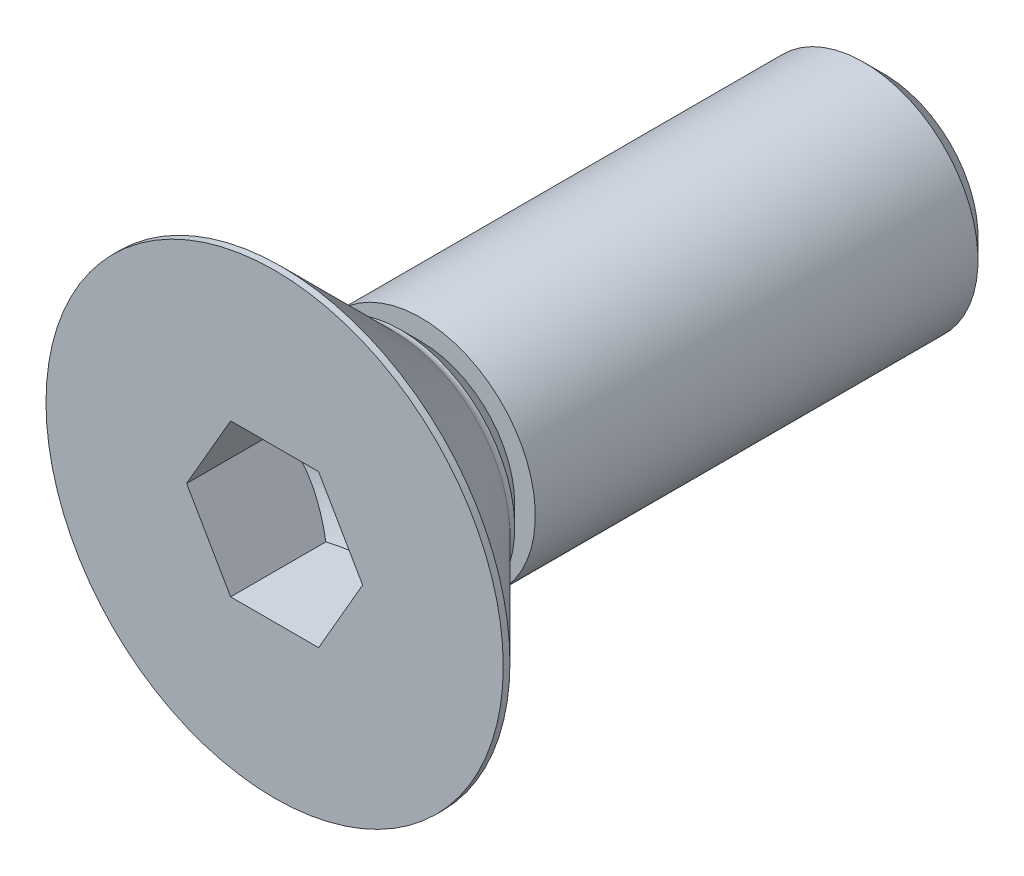
ISO-10303-21;
HEADER;
FILE_DESCRIPTION(('STEP AP214'),'2;1');
FILE_NAME('part.step','',(''),(''),'','','');
FILE_SCHEMA(('AUTOMOTIVE_DESIGN { 1 0 10303 214 1 1 1 1 }'));
ENDSEC;
DATA;
#1=APPLICATION_CONTEXT('core data for automotive mechanical design processes');
#2=APPLICATION_PROTOCOL_DEFINITION('international standard','automotive_design',2000,#1);
#3=PRODUCT_CONTEXT('',#1,'mechanical');
#4=PRODUCT('Part','Part','',(#3));
#5=PRODUCT_RELATED_PRODUCT_CATEGORY('part','',(#4));
#6=PRODUCT_DEFINITION_FORMATION('','',#4);
#7=PRODUCT_DEFINITION_CONTEXT('part definition',#1,'design');
#8=PRODUCT_DEFINITION('design','',#6,#7);
#9=PRODUCT_DEFINITION_SHAPE('','',#8);
#10=(LENGTH_UNIT() NAMED_UNIT(*) SI_UNIT(.MILLI.,.METRE.));
#11=(NAMED_UNIT(*) PLANE_ANGLE_UNIT() SI_UNIT($,.RADIAN.));
#12=(NAMED_UNIT(*) SI_UNIT($,.STERADIAN.) SOLID_ANGLE_UNIT());
#13=UNCERTAINTY_MEASURE_WITH_UNIT(LENGTH_MEASURE(1.E-05),#10,'distance_accuracy_value','');
#14=(GEOMETRIC_REPRESENTATION_CONTEXT(3) GLOBAL_UNCERTAINTY_ASSIGNED_CONTEXT((#13)) GLOBAL_UNIT_ASSIGNED_CONTEXT((#10,
#11,#12)) REPRESENTATION_CONTEXT('',''));
#15=CARTESIAN_POINT('',(0.,0.,0.));
#16=DIRECTION('',(0.,0.,1.));
#17=DIRECTION('',(1.,0.,0.));
#18=AXIS2_PLACEMENT_3D('',#15,#16,#17);
#19=CARTESIAN_POINT('',(0.,0.,-3.3));
#20=DIRECTION('',(0.,0.,-1.));
#21=DIRECTION('',(-1.,0.,0.));
#22=AXIS2_PLACEMENT_3D('',#19,#20,#21);
#23=TOROIDAL_SURFACE('',#22,3.3,0.3);
#24=CARTESIAN_POINT('',(0.,0.,-3.08786796564404));
#25=DIRECTION('',(0.,0.,-1.));
#26=DIRECTION('',(0.,1.,0.));
#27=AXIS2_PLACEMENT_3D('',#24,#25,#26);
#28=CIRCLE('',#27,3.08786796564404);
#29=CARTESIAN_POINT('',(0.,3.08786796564404,-3.08786796564404));
#30=VERTEX_POINT('',#29);
#31=EDGE_CURVE('E202',#30,#30,#28,.T.);
#32=ORIENTED_EDGE('',*,*,#31,.T.);
#33=EDGE_LOOP('',(#32));
#34=FACE_BOUND('',#33,.T.);
#35=CARTESIAN_POINT('',(0.,0.,-3.3));
#36=DIRECTION('',(0.,0.,-1.));
#37=DIRECTION('',(0.,1.,0.));
#38=AXIS2_PLACEMENT_3D('',#35,#36,#37);
#39=CIRCLE('',#38,3.);
#40=CARTESIAN_POINT('',(0.,3.,-3.3));
#41=VERTEX_POINT('',#40);
#42=EDGE_CURVE('E254',#41,#41,#39,.T.);
#43=ORIENTED_EDGE('',*,*,#42,.F.);
#44=EDGE_LOOP('',(#43));
#45=FACE_BOUND('',#44,.T.);
#46=ADVANCED_FACE('F46',(#34,#45),#23,.F.);
#47=CARTESIAN_POINT('',(0.,0.,-1.63180194846605));
#48=DIRECTION('',(0.,0.,1.));
#49=DIRECTION('',(0.,1.,0.));
#50=AXIS2_PLACEMENT_3D('',#47,#48,#49);
#51=CONICAL_SURFACE('',#50,4.54393398282202,0.785398163397448);
#52=CARTESIAN_POINT('',(0.,0.,-0.17573593128807));
#53=DIRECTION('',(0.,0.,-1.));
#54=DIRECTION('',(0.,1.,0.));
#55=AXIS2_PLACEMENT_3D('',#52,#53,#54);
#56=CIRCLE('',#55,6.);
#57=CARTESIAN_POINT('',(0.,6.,-0.17573593128807));
#58=VERTEX_POINT('',#57);
#59=EDGE_CURVE('E181',#58,#58,#56,.T.);
#60=ORIENTED_EDGE('',*,*,#59,.T.);
#61=EDGE_LOOP('',(#60));
#62=FACE_BOUND('',#61,.T.);
#63=ORIENTED_EDGE('',*,*,#31,.F.);
#64=EDGE_LOOP('',(#63));
#65=FACE_BOUND('',#64,.T.);
#66=ADVANCED_FACE('F295',(#62,#65),#51,.T.);
#67=CARTESIAN_POINT('',(0.,0.,-0.0878679656440351));
#68=DIRECTION('',(0.,0.,1.));
#69=DIRECTION('',(0.,1.,0.));
#70=AXIS2_PLACEMENT_3D('',#67,#68,#69);
#71=CYLINDRICAL_SURFACE('',#70,6.);
#72=CARTESIAN_POINT('',(0.,0.,0.));
#73=DIRECTION('',(0.,0.,-1.));
#74=DIRECTION('',(0.,1.,0.));
#75=AXIS2_PLACEMENT_3D('',#72,#73,#74);
#76=CIRCLE('',#75,6.);
#77=CARTESIAN_POINT('',(0.,6.,0.));
#78=VERTEX_POINT('',#77);
#79=EDGE_CURVE('E245',#78,#78,#76,.T.);
#80=ORIENTED_EDGE('',*,*,#79,.T.);
#81=EDGE_LOOP('',(#80));
#82=FACE_BOUND('',#81,.T.);
#83=ORIENTED_EDGE('',*,*,#59,.F.);
#84=EDGE_LOOP('',(#83));
#85=FACE_BOUND('',#84,.T.);
#86=ADVANCED_FACE('F298',(#82,#85),#71,.T.);
#87=CARTESIAN_POINT('',(0.,3.,0.));
#88=DIRECTION('',(0.,0.,1.));
#89=DIRECTION('',(0.,-1.,0.));
#90=AXIS2_PLACEMENT_3D('',#87,#88,#89);
#91=PLANE('',#90);
#92=ORIENTED_EDGE('',*,*,#79,.F.);
#93=EDGE_LOOP('',(#92));
#94=FACE_BOUND('',#93,.T.);
#95=DIRECTION('',(-0.5,0.866025403784439,0.));
#96=VECTOR('',#95,1.);
#97=CARTESIAN_POINT('',(-2.38156905283833,0.125000466250108,0.));
#98=LINE('',#97,#96);
#99=CARTESIAN_POINT('',(-1.1547,-1.99999906749978,0.));
#100=VERTEX_POINT('',#99);
#101=CARTESIAN_POINT('',(-2.3094,0.,0.));
#102=VERTEX_POINT('',#101);
#103=EDGE_CURVE('E215',#100,#102,#98,.T.);
#104=ORIENTED_EDGE('',*,*,#103,.T.);
#105=DIRECTION('',(0.5,0.866025403784439,0.));
#106=VECTOR('',#105,1.);
#107=CARTESIAN_POINT('',(-1.08253094716167,2.12499953374989,0.));
#108=LINE('',#107,#106);
#109=CARTESIAN_POINT('',(-1.1547,1.99999906749978,0.));
#110=VERTEX_POINT('',#109);
#111=EDGE_CURVE('E63',#102,#110,#108,.T.);
#112=ORIENTED_EDGE('',*,*,#111,.T.);
#113=DIRECTION('',(1.,0.,0.));
#114=VECTOR('',#113,1.);
#115=CARTESIAN_POINT('',(0.,1.99999906749978,0.));
#116=LINE('',#115,#114);
#117=CARTESIAN_POINT('',(1.1547,1.99999906749978,0.));
#118=VERTEX_POINT('',#117);
#119=EDGE_CURVE('E139',#110,#118,#116,.T.);
#120=ORIENTED_EDGE('',*,*,#119,.T.);
#121=DIRECTION('',(0.5,-0.866025403784439,0.));
#122=VECTOR('',#121,1.);
#123=CARTESIAN_POINT('',(1.08253094716167,2.12499953374989,0.));
#124=LINE('',#123,#122);
#125=CARTESIAN_POINT('',(2.3094,0.,0.));
#126=VERTEX_POINT('',#125);
#127=EDGE_CURVE('E174',#118,#126,#124,.T.);
#128=ORIENTED_EDGE('',*,*,#127,.T.);
#129=DIRECTION('',(-0.5,-0.866025403784439,0.));
#130=VECTOR('',#129,1.);
#131=CARTESIAN_POINT('',(2.38156905283833,0.125000466250108,0.));
#132=LINE('',#131,#130);
#133=CARTESIAN_POINT('',(1.1547,-1.99999906749978,0.));
#134=VERTEX_POINT('',#133);
#135=EDGE_CURVE('E128',#126,#134,#132,.T.);
#136=ORIENTED_EDGE('',*,*,#135,.T.);
#137=DIRECTION('',(-1.,0.,0.));
#138=VECTOR('',#137,1.);
#139=CARTESIAN_POINT('',(0.,-1.99999906749978,0.));
#140=LINE('',#139,#138);
#141=EDGE_CURVE('E99',#134,#100,#140,.T.);
#142=ORIENTED_EDGE('',*,*,#141,.T.);
#143=EDGE_LOOP('',(#104,#112,#120,#128,#136,#142));
#144=FACE_BOUND('',#143,.T.);
#145=ADVANCED_FACE('F300',(#94,#144),#91,.T.);
#146=CARTESIAN_POINT('',(-1.73205,0.999999533749891,1.));
#147=DIRECTION('',(-0.866025403784439,0.5,0.));
#148=DIRECTION('',(0.5,0.866025403784439,0.));
#149=AXIS2_PLACEMENT_3D('',#146,#147,#148);
#150=PLANE('',#149);
#151=ORIENTED_EDGE('',*,*,#111,.F.);
#152=DIRECTION('',(0.,0.,-1.));
#153=VECTOR('',#152,1.);
#154=CARTESIAN_POINT('',(-2.3094,0.,1.));
#155=LINE('',#154,#153);
#156=CARTESIAN_POINT('',(-2.3094,0.,-2.5));
#157=VERTEX_POINT('',#156);
#158=EDGE_CURVE('E208',#102,#157,#155,.T.);
#159=ORIENTED_EDGE('',*,*,#158,.T.);
#160=CARTESIAN_POINT('',(-2.3094,0.,-2.5));
#161=CARTESIAN_POINT('',(-1.73205,0.999999533749893,-2.83333317791663));
#162=CARTESIAN_POINT('',(-1.1547,1.99999906749978,-2.5));
#163=(BOUNDED_CURVE() B_SPLINE_CURVE(2,(#160,#161,#162),.UNSPECIFIED.,.F.,
.F.) B_SPLINE_CURVE_WITH_KNOTS((3,3),(0.,2.33687118658889),
.UNSPECIFIED.) CURVE() GEOMETRIC_REPRESENTATION_ITEM() RATIONAL_B_SPLINE_CURVE((1.,
1.15470053837925,1.)) REPRESENTATION_ITEM(''));
#164=CARTESIAN_POINT('',(-1.1547,1.99999906749978,-2.5));
#165=VERTEX_POINT('',#164);
#166=EDGE_CURVE('E224',#157,#165,#163,.T.);
#167=ORIENTED_EDGE('',*,*,#166,.T.);
#168=DIRECTION('',(0.,0.,-1.));
#169=VECTOR('',#168,1.);
#170=CARTESIAN_POINT('',(-1.1547,1.99999906749978,1.));
#171=LINE('',#170,#169);
#172=EDGE_CURVE('E230',#110,#165,#171,.T.);
#173=ORIENTED_EDGE('',*,*,#172,.F.);
#174=EDGE_LOOP('',(#151,#159,#167,#173));
#175=FACE_BOUND('',#174,.T.);
#176=ADVANCED_FACE('F307',(#175),#150,.F.);
#177=CARTESIAN_POINT('',(0.,1.99999906749978,1.));
#178=DIRECTION('',(0.,1.,0.));
#179=DIRECTION('',(1.,0.,0.));
#180=AXIS2_PLACEMENT_3D('',#177,#178,#179);
#181=PLANE('',#180);
#182=ORIENTED_EDGE('',*,*,#119,.F.);
#183=ORIENTED_EDGE('',*,*,#172,.T.);
#184=CARTESIAN_POINT('',(-1.1547,1.99999906749978,-2.5));
#185=CARTESIAN_POINT('',(0.,1.99999906749979,-2.83333317791663));
#186=CARTESIAN_POINT('',(1.1547,1.99999906749978,-2.5));
#187=(BOUNDED_CURVE() B_SPLINE_CURVE(2,(#184,#185,#186),.UNSPECIFIED.,.F.,
.F.) B_SPLINE_CURVE_WITH_KNOTS((3,3),(0.,2.33687118658889),
.UNSPECIFIED.) CURVE() GEOMETRIC_REPRESENTATION_ITEM() RATIONAL_B_SPLINE_CURVE((1.,
1.15470053837925,1.)) REPRESENTATION_ITEM(''));
#188=CARTESIAN_POINT('',(1.1547,1.99999906749978,-2.5));
#189=VERTEX_POINT('',#188);
#190=EDGE_CURVE('E142',#165,#189,#187,.T.);
#191=ORIENTED_EDGE('',*,*,#190,.T.);
#192=DIRECTION('',(0.,0.,-1.));
#193=VECTOR('',#192,1.);
#194=CARTESIAN_POINT('',(1.1547,1.99999906749978,1.));
#195=LINE('',#194,#193);
#196=EDGE_CURVE('E167',#118,#189,#195,.T.);
#197=ORIENTED_EDGE('',*,*,#196,.F.);
#198=EDGE_LOOP('',(#182,#183,#191,#197));
#199=FACE_BOUND('',#198,.T.);
#200=ADVANCED_FACE('F326',(#199),#181,.F.);
#201=CARTESIAN_POINT('',(-1.73205,-0.999999533749891,1.));
#202=DIRECTION('',(-0.866025403784439,-0.5,0.));
#203=DIRECTION('',(-0.5,0.866025403784439,0.));
#204=AXIS2_PLACEMENT_3D('',#201,#202,#203);
#205=PLANE('',#204);
#206=ORIENTED_EDGE('',*,*,#103,.F.);
#207=DIRECTION('',(0.,0.,-1.));
#208=VECTOR('',#207,1.);
#209=CARTESIAN_POINT('',(-1.1547,-1.99999906749978,1.));
#210=LINE('',#209,#208);
#211=CARTESIAN_POINT('',(-1.1547,-1.99999906749978,-2.5));
#212=VERTEX_POINT('',#211);
#213=EDGE_CURVE('E115',#100,#212,#210,.T.);
#214=ORIENTED_EDGE('',*,*,#213,.T.);
#215=CARTESIAN_POINT('',(-1.1547,-1.99999906749978,-2.5));
#216=CARTESIAN_POINT('',(-1.73205,-0.999999533749891,-2.83333317791663));
#217=CARTESIAN_POINT('',(-2.3094,0.,-2.5));
#218=(BOUNDED_CURVE() B_SPLINE_CURVE(2,(#215,#216,#217),.UNSPECIFIED.,.F.,
.F.) B_SPLINE_CURVE_WITH_KNOTS((3,3),(0.,2.33687118658889),
.UNSPECIFIED.) CURVE() GEOMETRIC_REPRESENTATION_ITEM() RATIONAL_B_SPLINE_CURVE((1.,
1.15470053837925,1.)) REPRESENTATION_ITEM(''));
#219=EDGE_CURVE('E112',#212,#157,#218,.T.);
#220=ORIENTED_EDGE('',*,*,#219,.T.);
#221=ORIENTED_EDGE('',*,*,#158,.F.);
#222=EDGE_LOOP('',(#206,#214,#220,#221));
#223=FACE_BOUND('',#222,.T.);
#224=ADVANCED_FACE('F324',(#223),#205,.F.);
#225=CARTESIAN_POINT('',(0.,0.,-3.16666635583326));
#226=DIRECTION('',(0.,0.,1.));
#227=DIRECTION('',(0.,1.,0.));
#228=AXIS2_PLACEMENT_3D('',#225,#226,#227);
#229=CONICAL_SURFACE('',#228,1.1547,1.0471975511966);
#230=CARTESIAN_POINT('',(0.,0.,-3.83333271166652));
#231=VERTEX_POINT('',#230);
#232=VERTEX_LOOP('',#231);
#233=FACE_BOUND('',#232,.T.);
#234=CARTESIAN_POINT('',(1.1547,1.99999906749978,-2.5));
#235=CARTESIAN_POINT('',(1.73205,0.999999533749893,-2.83333317791663));
#236=CARTESIAN_POINT('',(2.3094,0.,-2.5));
#237=(BOUNDED_CURVE() B_SPLINE_CURVE(2,(#234,#235,#236),.UNSPECIFIED.,.F.,
.F.) B_SPLINE_CURVE_WITH_KNOTS((3,3),(0.,2.33687118658889),
.UNSPECIFIED.) CURVE() GEOMETRIC_REPRESENTATION_ITEM() RATIONAL_B_SPLINE_CURVE((1.,
1.15470053837925,1.)) REPRESENTATION_ITEM(''));
#238=CARTESIAN_POINT('',(2.3094,0.,-2.5));
#239=VERTEX_POINT('',#238);
#240=EDGE_CURVE('E163',#189,#239,#237,.T.);
#241=ORIENTED_EDGE('',*,*,#240,.F.);
#242=ORIENTED_EDGE('',*,*,#190,.F.);
#243=ORIENTED_EDGE('',*,*,#166,.F.);
#244=ORIENTED_EDGE('',*,*,#219,.F.);
#245=CARTESIAN_POINT('',(1.1547,-1.99999906749978,-2.5));
#246=CARTESIAN_POINT('',(0.,-1.99999906749979,-2.83333317791663));
#247=CARTESIAN_POINT('',(-1.1547,-1.99999906749978,-2.5));
#248=(BOUNDED_CURVE() B_SPLINE_CURVE(2,(#245,#246,#247),.UNSPECIFIED.,.F.,
.F.) B_SPLINE_CURVE_WITH_KNOTS((3,3),(0.,2.33687118658889),
.UNSPECIFIED.) CURVE() GEOMETRIC_REPRESENTATION_ITEM() RATIONAL_B_SPLINE_CURVE((1.,
1.15470053837925,1.)) REPRESENTATION_ITEM(''));
#249=CARTESIAN_POINT('',(1.1547,-1.99999906749978,-2.5));
#250=VERTEX_POINT('',#249);
#251=EDGE_CURVE('E104',#250,#212,#248,.T.);
#252=ORIENTED_EDGE('',*,*,#251,.F.);
#253=CARTESIAN_POINT('',(2.3094,0.,-2.5));
#254=CARTESIAN_POINT('',(1.73205,-0.999999533749891,-2.83333317791663));
#255=CARTESIAN_POINT('',(1.1547,-1.99999906749978,-2.5));
#256=(BOUNDED_CURVE() B_SPLINE_CURVE(2,(#253,#254,#255),.UNSPECIFIED.,.F.,
.F.) B_SPLINE_CURVE_WITH_KNOTS((3,3),(0.,2.33687118658888),
.UNSPECIFIED.) CURVE() GEOMETRIC_REPRESENTATION_ITEM() RATIONAL_B_SPLINE_CURVE((1.,
1.15470053837925,1.)) REPRESENTATION_ITEM(''));
#257=EDGE_CURVE('E108',#239,#250,#256,.T.);
#258=ORIENTED_EDGE('',*,*,#257,.F.);
#259=EDGE_LOOP('',(#241,#242,#243,#244,#252,#258));
#260=FACE_BOUND('',#259,.T.);
#261=ADVANCED_FACE('F106',(#233,#260),#229,.F.);
#262=CARTESIAN_POINT('',(0.,-1.99999906749978,1.));
#263=DIRECTION('',(0.,-1.,0.));
#264=DIRECTION('',(-1.,0.,0.));
#265=AXIS2_PLACEMENT_3D('',#262,#263,#264);
#266=PLANE('',#265);
#267=ORIENTED_EDGE('',*,*,#141,.F.);
#268=DIRECTION('',(0.,0.,-1.));
#269=VECTOR('',#268,1.);
#270=CARTESIAN_POINT('',(1.1547,-1.99999906749978,1.));
#271=LINE('',#270,#269);
#272=EDGE_CURVE('E117',#134,#250,#271,.T.);
#273=ORIENTED_EDGE('',*,*,#272,.T.);
#274=ORIENTED_EDGE('',*,*,#251,.T.);
#275=ORIENTED_EDGE('',*,*,#213,.F.);
#276=EDGE_LOOP('',(#267,#273,#274,#275));
#277=FACE_BOUND('',#276,.T.);
#278=ADVANCED_FACE('F118',(#277),#266,.F.);
#279=CARTESIAN_POINT('',(1.73205,-0.999999533749891,1.));
#280=DIRECTION('',(0.866025403784439,-0.5,0.));
#281=DIRECTION('',(-0.5,-0.866025403784439,0.));
#282=AXIS2_PLACEMENT_3D('',#279,#280,#281);
#283=PLANE('',#282);
#284=ORIENTED_EDGE('',*,*,#135,.F.);
#285=DIRECTION('',(0.,0.,-1.));
#286=VECTOR('',#285,1.);
#287=CARTESIAN_POINT('',(2.3094,0.,1.));
#288=LINE('',#287,#286);
#289=EDGE_CURVE('E125',#126,#239,#288,.T.);
#290=ORIENTED_EDGE('',*,*,#289,.T.);
#291=ORIENTED_EDGE('',*,*,#257,.T.);
#292=ORIENTED_EDGE('',*,*,#272,.F.);
#293=EDGE_LOOP('',(#284,#290,#291,#292));
#294=FACE_BOUND('',#293,.T.);
#295=ADVANCED_FACE('F123',(#294),#283,.F.);
#296=CARTESIAN_POINT('',(1.73205,0.999999533749891,1.));
#297=DIRECTION('',(0.866025403784439,0.5,0.));
#298=DIRECTION('',(0.5,-0.866025403784439,0.));
#299=AXIS2_PLACEMENT_3D('',#296,#297,#298);
#300=PLANE('',#299);
#301=ORIENTED_EDGE('',*,*,#127,.F.);
#302=ORIENTED_EDGE('',*,*,#196,.T.);
#303=ORIENTED_EDGE('',*,*,#240,.T.);
#304=ORIENTED_EDGE('',*,*,#289,.F.);
#305=EDGE_LOOP('',(#301,#302,#303,#304));
#306=FACE_BOUND('',#305,.T.);
#307=ADVANCED_FACE('F320',(#306),#300,.F.);
#308=CARTESIAN_POINT('',(0.,0.,-3.570625));
#309=DIRECTION('',(0.,0.,1.));
#310=DIRECTION('',(0.,1.,0.));
#311=AXIS2_PLACEMENT_3D('',#308,#309,#310);
#312=CONICAL_SURFACE('',#311,2.729375,0.785398163397448);
#313=CARTESIAN_POINT('',(0.,0.,-3.84125));
#314=DIRECTION('',(0.,0.,-1.));
#315=DIRECTION('',(-1.,0.,0.));
#316=AXIS2_PLACEMENT_3D('',#313,#314,#315);
#317=CIRCLE('',#316,2.45875);
#318=CARTESIAN_POINT('',(-2.45875,0.,-3.84125));
#319=VERTEX_POINT('',#318);
#320=EDGE_CURVE('E240',#319,#319,#317,.F.);
#321=ORIENTED_EDGE('',*,*,#320,.T.);
#322=EDGE_LOOP('',(#321));
#323=FACE_BOUND('',#322,.T.);
#324=ORIENTED_EDGE('',*,*,#42,.T.);
#325=EDGE_LOOP('',(#324));
#326=FACE_BOUND('',#325,.T.);
#327=ADVANCED_FACE('F323',(#323,#326),#312,.T.);
#328=CARTESIAN_POINT('',(0.,0.,-16.));
#329=DIRECTION('',(0.,0.,1.));
#330=DIRECTION('',(1.,0.,0.));
#331=AXIS2_PLACEMENT_3D('',#328,#329,#330);
#332=CYLINDRICAL_SURFACE('',#331,3.);
#333=CARTESIAN_POINT('',(0.,0.,-15.45875));
#334=DIRECTION('',(0.,0.,-1.));
#335=DIRECTION('',(-1.,0.,0.));
#336=AXIS2_PLACEMENT_3D('',#333,#334,#335);
#337=CIRCLE('',#336,3.);
#338=CARTESIAN_POINT('',(-3.,0.,-15.45875));
#339=VERTEX_POINT('',#338);
#340=EDGE_CURVE('E56',#339,#339,#337,.F.);
#341=ORIENTED_EDGE('',*,*,#340,.T.);
#342=EDGE_LOOP('',(#341));
#343=FACE_BOUND('',#342,.T.);
#344=CARTESIAN_POINT('',(0.,0.,-3.84125));
#345=DIRECTION('',(0.,0.,1.));
#346=DIRECTION('',(-1.,0.,0.));
#347=AXIS2_PLACEMENT_3D('',#344,#345,#346);
#348=CIRCLE('',#347,3.);
#349=CARTESIAN_POINT('',(-3.,0.,-3.84125));
#350=VERTEX_POINT('',#349);
#351=EDGE_CURVE('E366',#350,#350,#348,.T.);
#352=ORIENTED_EDGE('',*,*,#351,.F.);
#353=EDGE_LOOP('',(#352));
#354=FACE_BOUND('',#353,.T.);
#355=ADVANCED_FACE('F454',(#343,#354),#332,.T.);
#356=CARTESIAN_POINT('',(0.,0.,-16.));
#357=DIRECTION('',(0.,0.,-1.));
#358=DIRECTION('',(-1.,0.,0.));
#359=AXIS2_PLACEMENT_3D('',#356,#357,#358);
#360=PLANE('',#359);
#361=CARTESIAN_POINT('',(0.,0.,-16.));
#362=DIRECTION('',(0.,0.,-1.));
#363=DIRECTION('',(-1.,0.,0.));
#364=AXIS2_PLACEMENT_3D('',#361,#362,#363);
#365=CIRCLE('',#364,2.45874999999999);
#366=CARTESIAN_POINT('',(-2.45874999999999,0.,-16.));
#367=VERTEX_POINT('',#366);
#368=EDGE_CURVE('E12',#367,#367,#365,.T.);
#369=ORIENTED_EDGE('',*,*,#368,.T.);
#370=EDGE_LOOP('',(#369));
#371=FACE_BOUND('',#370,.T.);
#372=ADVANCED_FACE('F588',(#371),#360,.T.);
#373=CARTESIAN_POINT('',(0.,0.,-3.84125));
#374=DIRECTION('',(0.,0.,-1.));
#375=DIRECTION('',(-1.,0.,0.));
#376=AXIS2_PLACEMENT_3D('',#373,#374,#375);
#377=PLANE('',#376);
#378=ORIENTED_EDGE('',*,*,#320,.F.);
#379=EDGE_LOOP('',(#378));
#380=FACE_BOUND('',#379,.T.);
#381=ORIENTED_EDGE('',*,*,#351,.T.);
#382=EDGE_LOOP('',(#381));
#383=FACE_BOUND('',#382,.T.);
#384=ADVANCED_FACE('F583',(#380,#383),#377,.F.);
#385=CARTESIAN_POINT('',(0.,0.,-15.45875));
#386=DIRECTION('',(0.,0.,1.));
#387=DIRECTION('',(1.,0.,0.));
#388=AXIS2_PLACEMENT_3D('',#385,#386,#387);
#389=CONICAL_SURFACE('',#388,3.,0.785398163397456);
#390=ORIENTED_EDGE('',*,*,#368,.F.);
#391=EDGE_LOOP('',(#390));
#392=FACE_BOUND('',#391,.T.);
#393=ORIENTED_EDGE('',*,*,#340,.F.);
#394=EDGE_LOOP('',(#393));
#395=FACE_BOUND('',#394,.T.);
#396=ADVANCED_FACE('F49',(#392,#395),#389,.T.);
#397=CLOSED_SHELL('',(#46,#66,#86,#145,#176,#200,#224,#261,#278,#295,#307,#327,#355,#372,#384,#396));
#398=MANIFOLD_SOLID_BREP('B2',#397);
#399=ADVANCED_BREP_SHAPE_REPRESENTATION('',(#18,#398),#14);
#400=SHAPE_DEFINITION_REPRESENTATION(#9,#399);
ENDSEC;
END-ISO-10303-21;
